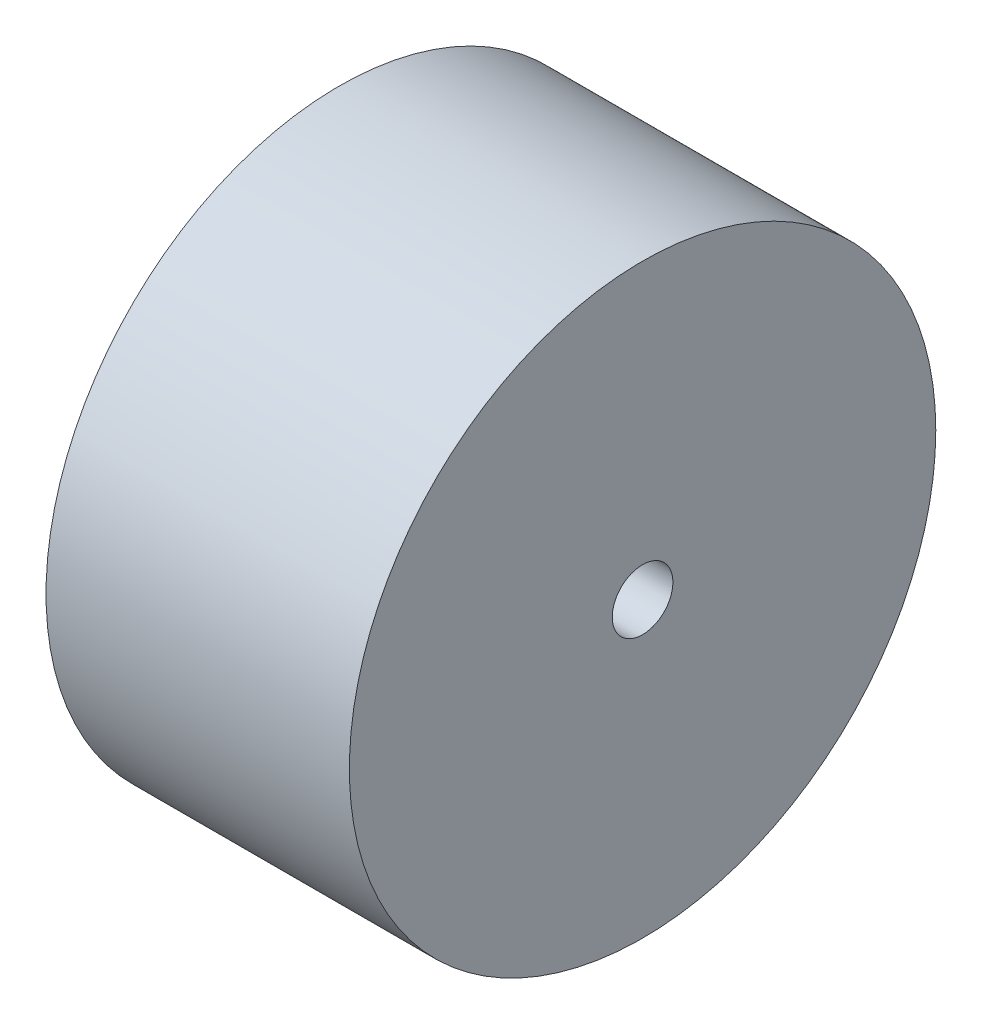
ISO-10303-21;
HEADER;
FILE_DESCRIPTION(('STEP AP214'),'2;1');
FILE_NAME('part.step','',(''),(''),'','','');
FILE_SCHEMA(('AUTOMOTIVE_DESIGN { 1 0 10303 214 1 1 1 1 }'));
ENDSEC;
DATA;
#1=APPLICATION_CONTEXT('core data for automotive mechanical design processes');
#2=APPLICATION_PROTOCOL_DEFINITION('international standard','automotive_design',2000,#1);
#3=PRODUCT_CONTEXT('',#1,'mechanical');
#4=PRODUCT('Part','Part','',(#3));
#5=PRODUCT_RELATED_PRODUCT_CATEGORY('part','',(#4));
#6=PRODUCT_DEFINITION_FORMATION('','',#4);
#7=PRODUCT_DEFINITION_CONTEXT('part definition',#1,'design');
#8=PRODUCT_DEFINITION('design','',#6,#7);
#9=PRODUCT_DEFINITION_SHAPE('','',#8);
#10=(LENGTH_UNIT() NAMED_UNIT(*) SI_UNIT(.MILLI.,.METRE.));
#11=(NAMED_UNIT(*) PLANE_ANGLE_UNIT() SI_UNIT($,.RADIAN.));
#12=(NAMED_UNIT(*) SI_UNIT($,.STERADIAN.) SOLID_ANGLE_UNIT());
#13=UNCERTAINTY_MEASURE_WITH_UNIT(LENGTH_MEASURE(1.E-05),#10,'distance_accuracy_value','');
#14=(GEOMETRIC_REPRESENTATION_CONTEXT(3) GLOBAL_UNCERTAINTY_ASSIGNED_CONTEXT((#13)) GLOBAL_UNIT_ASSIGNED_CONTEXT((#10,
#11,#12)) REPRESENTATION_CONTEXT('',''));
#15=CARTESIAN_POINT('',(0.,0.,0.));
#16=DIRECTION('',(0.,0.,1.));
#17=DIRECTION('',(1.,0.,0.));
#18=AXIS2_PLACEMENT_3D('',#15,#16,#17);
#19=CARTESIAN_POINT('',(30.,0.,0.));
#20=DIRECTION('',(1.,0.,0.));
#21=DIRECTION('',(0.,0.,-1.));
#22=AXIS2_PLACEMENT_3D('',#19,#20,#21);
#23=PLANE('',#22);
#24=CARTESIAN_POINT('',(30.,0.,0.));
#25=DIRECTION('',(1.,0.,0.));
#26=DIRECTION('',(0.,0.,-1.));
#27=AXIS2_PLACEMENT_3D('',#24,#25,#26);
#28=CIRCLE('',#27,29.);
#29=CARTESIAN_POINT('',(30.,0.,-29.));
#30=VERTEX_POINT('',#29);
#31=EDGE_CURVE('E10',#30,#30,#28,.T.);
#32=ORIENTED_EDGE('',*,*,#31,.T.);
#33=EDGE_LOOP('',(#32));
#34=FACE_BOUND('',#33,.T.);
#35=CARTESIAN_POINT('',(30.,0.,0.));
#36=DIRECTION('',(1.,0.,0.));
#37=DIRECTION('',(0.,0.,-1.));
#38=AXIS2_PLACEMENT_3D('',#35,#36,#37);
#39=CIRCLE('',#38,3.);
#40=CARTESIAN_POINT('',(30.,0.,-3.));
#41=VERTEX_POINT('',#40);
#42=EDGE_CURVE('E45',#41,#41,#39,.T.);
#43=ORIENTED_EDGE('',*,*,#42,.F.);
#44=EDGE_LOOP('',(#43));
#45=FACE_BOUND('',#44,.T.);
#46=ADVANCED_FACE('F34',(#34,#45),#23,.T.);
#47=CARTESIAN_POINT('',(0.,0.,0.));
#48=DIRECTION('',(1.,0.,0.));
#49=DIRECTION('',(0.,0.,-1.));
#50=AXIS2_PLACEMENT_3D('',#47,#48,#49);
#51=PLANE('',#50);
#52=CARTESIAN_POINT('',(0.,0.,0.));
#53=DIRECTION('',(1.,0.,0.));
#54=DIRECTION('',(0.,0.,-1.));
#55=AXIS2_PLACEMENT_3D('',#52,#53,#54);
#56=CIRCLE('',#55,29.);
#57=CARTESIAN_POINT('',(0.,0.,-29.));
#58=VERTEX_POINT('',#57);
#59=EDGE_CURVE('E38',#58,#58,#56,.T.);
#60=ORIENTED_EDGE('',*,*,#59,.F.);
#61=EDGE_LOOP('',(#60));
#62=FACE_BOUND('',#61,.T.);
#63=CARTESIAN_POINT('',(0.,0.,0.));
#64=DIRECTION('',(1.,0.,0.));
#65=DIRECTION('',(0.,0.,-1.));
#66=AXIS2_PLACEMENT_3D('',#63,#64,#65);
#67=CIRCLE('',#66,3.);
#68=CARTESIAN_POINT('',(0.,0.,-3.));
#69=VERTEX_POINT('',#68);
#70=EDGE_CURVE('E47',#69,#69,#67,.T.);
#71=ORIENTED_EDGE('',*,*,#70,.T.);
#72=EDGE_LOOP('',(#71));
#73=FACE_BOUND('',#72,.T.);
#74=ADVANCED_FACE('F57',(#62,#73),#51,.F.);
#75=CARTESIAN_POINT('',(30.,0.,0.));
#76=DIRECTION('',(-1.,0.,0.));
#77=DIRECTION('',(0.,0.,1.));
#78=AXIS2_PLACEMENT_3D('',#75,#76,#77);
#79=CYLINDRICAL_SURFACE('',#78,29.);
#80=ORIENTED_EDGE('',*,*,#31,.F.);
#81=EDGE_LOOP('',(#80));
#82=FACE_BOUND('',#81,.T.);
#83=ORIENTED_EDGE('',*,*,#59,.T.);
#84=EDGE_LOOP('',(#83));
#85=FACE_BOUND('',#84,.T.);
#86=ADVANCED_FACE('F36',(#82,#85),#79,.T.);
#87=CARTESIAN_POINT('',(30.,0.,0.));
#88=DIRECTION('',(-1.,0.,0.));
#89=DIRECTION('',(0.,0.,1.));
#90=AXIS2_PLACEMENT_3D('',#87,#88,#89);
#91=CYLINDRICAL_SURFACE('',#90,3.);
#92=ORIENTED_EDGE('',*,*,#42,.T.);
#93=EDGE_LOOP('',(#92));
#94=FACE_BOUND('',#93,.T.);
#95=ORIENTED_EDGE('',*,*,#70,.F.);
#96=EDGE_LOOP('',(#95));
#97=FACE_BOUND('',#96,.T.);
#98=ADVANCED_FACE('F53',(#94,#97),#91,.F.);
#99=CLOSED_SHELL('',(#46,#74,#86,#98));
#100=MANIFOLD_SOLID_BREP('B2',#99);
#101=ADVANCED_BREP_SHAPE_REPRESENTATION('',(#18,#100),#14);
#102=SHAPE_DEFINITION_REPRESENTATION(#9,#101);
ENDSEC;
END-ISO-10303-21;
